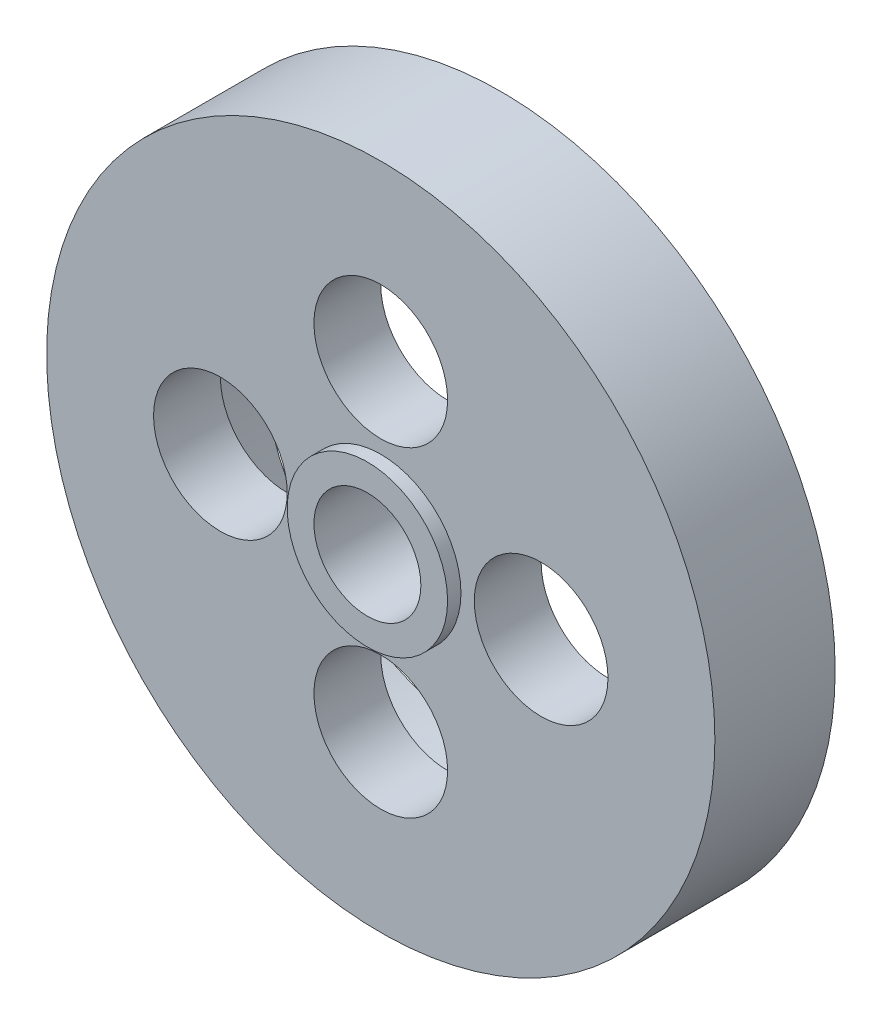
ISO-10303-21;
HEADER;
FILE_DESCRIPTION(('STEP AP214'),'2;1');
FILE_NAME('part.step','',(''),(''),'','','');
FILE_SCHEMA(('AUTOMOTIVE_DESIGN { 1 0 10303 214 1 1 1 1 }'));
ENDSEC;
DATA;
#1=APPLICATION_CONTEXT('core data for automotive mechanical design processes');
#2=APPLICATION_PROTOCOL_DEFINITION('international standard','automotive_design',2000,#1);
#3=PRODUCT_CONTEXT('',#1,'mechanical');
#4=PRODUCT('Part','Part','',(#3));
#5=PRODUCT_RELATED_PRODUCT_CATEGORY('part','',(#4));
#6=PRODUCT_DEFINITION_FORMATION('','',#4);
#7=PRODUCT_DEFINITION_CONTEXT('part definition',#1,'design');
#8=PRODUCT_DEFINITION('design','',#6,#7);
#9=PRODUCT_DEFINITION_SHAPE('','',#8);
#10=(LENGTH_UNIT() NAMED_UNIT(*) SI_UNIT(.MILLI.,.METRE.));
#11=(NAMED_UNIT(*) PLANE_ANGLE_UNIT() SI_UNIT($,.RADIAN.));
#12=(NAMED_UNIT(*) SI_UNIT($,.STERADIAN.) SOLID_ANGLE_UNIT());
#13=UNCERTAINTY_MEASURE_WITH_UNIT(LENGTH_MEASURE(1.E-05),#10,'distance_accuracy_value','');
#14=(GEOMETRIC_REPRESENTATION_CONTEXT(3) GLOBAL_UNCERTAINTY_ASSIGNED_CONTEXT((#13)) GLOBAL_UNIT_ASSIGNED_CONTEXT((#10,
#11,#12)) REPRESENTATION_CONTEXT('',''));
#15=CARTESIAN_POINT('',(0.,0.,0.));
#16=DIRECTION('',(0.,0.,1.));
#17=DIRECTION('',(1.,0.,0.));
#18=AXIS2_PLACEMENT_3D('',#15,#16,#17);
#19=CARTESIAN_POINT('',(0.,0.,9.));
#20=DIRECTION('',(0.,0.,1.));
#21=DIRECTION('',(1.,0.,0.));
#22=AXIS2_PLACEMENT_3D('',#19,#20,#21);
#23=PLANE('',#22);
#24=CARTESIAN_POINT('',(-12.,0.,9.));
#25=DIRECTION('',(0.,0.,1.));
#26=DIRECTION('',(1.,0.,0.));
#27=AXIS2_PLACEMENT_3D('',#24,#25,#26);
#28=CIRCLE('',#27,5.00000000000012);
#29=CARTESIAN_POINT('',(-6.99999999999988,0.,9.));
#30=VERTEX_POINT('',#29);
#31=EDGE_CURVE('E67',#30,#30,#28,.T.);
#32=ORIENTED_EDGE('',*,*,#31,.F.);
#33=EDGE_LOOP('',(#32));
#34=FACE_BOUND('',#33,.T.);
#35=CARTESIAN_POINT('',(12.,0.,9.));
#36=DIRECTION('',(0.,0.,1.));
#37=DIRECTION('',(1.,0.,0.));
#38=AXIS2_PLACEMENT_3D('',#35,#36,#37);
#39=CIRCLE('',#38,5.);
#40=CARTESIAN_POINT('',(17.,0.,9.));
#41=VERTEX_POINT('',#40);
#42=EDGE_CURVE('E59',#41,#41,#39,.T.);
#43=ORIENTED_EDGE('',*,*,#42,.F.);
#44=EDGE_LOOP('',(#43));
#45=FACE_BOUND('',#44,.T.);
#46=CARTESIAN_POINT('',(0.,12.,9.));
#47=DIRECTION('',(0.,0.,1.));
#48=DIRECTION('',(1.,0.,0.));
#49=AXIS2_PLACEMENT_3D('',#46,#47,#48);
#50=CIRCLE('',#49,5.);
#51=CARTESIAN_POINT('',(5.,12.,9.));
#52=VERTEX_POINT('',#51);
#53=EDGE_CURVE('E54',#52,#52,#50,.T.);
#54=ORIENTED_EDGE('',*,*,#53,.F.);
#55=EDGE_LOOP('',(#54));
#56=FACE_BOUND('',#55,.T.);
#57=CARTESIAN_POINT('',(0.,0.,9.));
#58=DIRECTION('',(0.,0.,1.));
#59=DIRECTION('',(1.,0.,0.));
#60=AXIS2_PLACEMENT_3D('',#57,#58,#59);
#61=CIRCLE('',#60,25.);
#62=CARTESIAN_POINT('',(25.,0.,9.));
#63=VERTEX_POINT('',#62);
#64=EDGE_CURVE('E10',#63,#63,#61,.T.);
#65=ORIENTED_EDGE('',*,*,#64,.T.);
#66=EDGE_LOOP('',(#65));
#67=FACE_BOUND('',#66,.T.);
#68=CARTESIAN_POINT('',(0.,-12.,9.));
#69=DIRECTION('',(0.,0.,1.));
#70=DIRECTION('',(1.,0.,0.));
#71=AXIS2_PLACEMENT_3D('',#68,#69,#70);
#72=CIRCLE('',#71,5.00000000000008);
#73=CARTESIAN_POINT('',(5.00000000000008,-12.,9.));
#74=VERTEX_POINT('',#73);
#75=EDGE_CURVE('E63',#74,#74,#72,.T.);
#76=ORIENTED_EDGE('',*,*,#75,.F.);
#77=EDGE_LOOP('',(#76));
#78=FACE_BOUND('',#77,.T.);
#79=CARTESIAN_POINT('',(0.,0.,9.));
#80=DIRECTION('',(0.,0.,1.));
#81=DIRECTION('',(1.,0.,0.));
#82=AXIS2_PLACEMENT_3D('',#79,#80,#81);
#83=CIRCLE('',#82,6.);
#84=CARTESIAN_POINT('',(6.,0.,9.));
#85=VERTEX_POINT('',#84);
#86=EDGE_CURVE('E96',#85,#85,#83,.T.);
#87=ORIENTED_EDGE('',*,*,#86,.F.);
#88=EDGE_LOOP('',(#87));
#89=FACE_BOUND('',#88,.T.);
#90=ADVANCED_FACE('F39',(#34,#45,#56,#67,#78,#89),#23,.T.);
#91=CARTESIAN_POINT('',(0.,12.,9.));
#92=DIRECTION('',(0.,0.,-1.));
#93=DIRECTION('',(-1.,0.,0.));
#94=AXIS2_PLACEMENT_3D('',#91,#92,#93);
#95=CYLINDRICAL_SURFACE('',#94,5.);
#96=ORIENTED_EDGE('',*,*,#53,.T.);
#97=EDGE_LOOP('',(#96));
#98=FACE_BOUND('',#97,.T.);
#99=CARTESIAN_POINT('',(0.,12.,4.));
#100=DIRECTION('',(0.,0.,-1.));
#101=DIRECTION('',(-1.,0.,0.));
#102=AXIS2_PLACEMENT_3D('',#99,#100,#101);
#103=CIRCLE('',#102,5.);
#104=CARTESIAN_POINT('',(-5.,12.,4.));
#105=VERTEX_POINT('',#104);
#106=EDGE_CURVE('E71',#105,#105,#103,.T.);
#107=ORIENTED_EDGE('',*,*,#106,.T.);
#108=EDGE_LOOP('',(#107));
#109=FACE_BOUND('',#108,.T.);
#110=ADVANCED_FACE('F126',(#98,#109),#95,.F.);
#111=CARTESIAN_POINT('',(0.,0.,9.));
#112=DIRECTION('',(0.,0.,-1.));
#113=DIRECTION('',(-1.,0.,0.));
#114=AXIS2_PLACEMENT_3D('',#111,#112,#113);
#115=CYLINDRICAL_SURFACE('',#114,4.);
#116=CARTESIAN_POINT('',(0.,0.,4.));
#117=DIRECTION('',(0.,0.,-1.));
#118=DIRECTION('',(-1.,0.,0.));
#119=AXIS2_PLACEMENT_3D('',#116,#117,#118);
#120=CIRCLE('',#119,4.);
#121=CARTESIAN_POINT('',(-4.,0.,4.));
#122=VERTEX_POINT('',#121);
#123=EDGE_CURVE('E75',#122,#122,#120,.T.);
#124=ORIENTED_EDGE('',*,*,#123,.T.);
#125=EDGE_LOOP('',(#124));
#126=FACE_BOUND('',#125,.T.);
#127=CARTESIAN_POINT('',(0.,0.,10.));
#128=DIRECTION('',(0.,0.,1.));
#129=DIRECTION('',(1.,0.,0.));
#130=AXIS2_PLACEMENT_3D('',#127,#128,#129);
#131=CIRCLE('',#130,4.);
#132=CARTESIAN_POINT('',(4.,0.,10.));
#133=VERTEX_POINT('',#132);
#134=EDGE_CURVE('E100',#133,#133,#131,.T.);
#135=ORIENTED_EDGE('',*,*,#134,.T.);
#136=EDGE_LOOP('',(#135));
#137=FACE_BOUND('',#136,.T.);
#138=ADVANCED_FACE('F108',(#126,#137),#115,.F.);
#139=CARTESIAN_POINT('',(12.,0.,9.));
#140=DIRECTION('',(0.,0.,-1.));
#141=DIRECTION('',(-1.,0.,0.));
#142=AXIS2_PLACEMENT_3D('',#139,#140,#141);
#143=CYLINDRICAL_SURFACE('',#142,5.);
#144=ORIENTED_EDGE('',*,*,#42,.T.);
#145=EDGE_LOOP('',(#144));
#146=FACE_BOUND('',#145,.T.);
#147=CARTESIAN_POINT('',(12.,0.,4.));
#148=DIRECTION('',(0.,0.,-1.));
#149=DIRECTION('',(-1.,0.,0.));
#150=AXIS2_PLACEMENT_3D('',#147,#148,#149);
#151=CIRCLE('',#150,5.);
#152=CARTESIAN_POINT('',(7.,0.,4.));
#153=VERTEX_POINT('',#152);
#154=EDGE_CURVE('E79',#153,#153,#151,.T.);
#155=ORIENTED_EDGE('',*,*,#154,.T.);
#156=EDGE_LOOP('',(#155));
#157=FACE_BOUND('',#156,.T.);
#158=ADVANCED_FACE('F163',(#146,#157),#143,.F.);
#159=CARTESIAN_POINT('',(0.,-12.,9.));
#160=DIRECTION('',(0.,0.,-1.));
#161=DIRECTION('',(-1.,0.,0.));
#162=AXIS2_PLACEMENT_3D('',#159,#160,#161);
#163=CYLINDRICAL_SURFACE('',#162,5.00000000000008);
#164=ORIENTED_EDGE('',*,*,#75,.T.);
#165=EDGE_LOOP('',(#164));
#166=FACE_BOUND('',#165,.T.);
#167=CARTESIAN_POINT('',(0.,-12.,4.));
#168=DIRECTION('',(0.,0.,-1.));
#169=DIRECTION('',(-1.,0.,0.));
#170=AXIS2_PLACEMENT_3D('',#167,#168,#169);
#171=CIRCLE('',#170,5.00000000000008);
#172=CARTESIAN_POINT('',(-5.00000000000008,-12.,4.));
#173=VERTEX_POINT('',#172);
#174=EDGE_CURVE('E83',#173,#173,#171,.T.);
#175=ORIENTED_EDGE('',*,*,#174,.T.);
#176=EDGE_LOOP('',(#175));
#177=FACE_BOUND('',#176,.T.);
#178=ADVANCED_FACE('F146',(#166,#177),#163,.F.);
#179=CARTESIAN_POINT('',(-12.,0.,9.));
#180=DIRECTION('',(0.,0.,-1.));
#181=DIRECTION('',(-1.,0.,0.));
#182=AXIS2_PLACEMENT_3D('',#179,#180,#181);
#183=CYLINDRICAL_SURFACE('',#182,5.00000000000012);
#184=ORIENTED_EDGE('',*,*,#31,.T.);
#185=EDGE_LOOP('',(#184));
#186=FACE_BOUND('',#185,.T.);
#187=CARTESIAN_POINT('',(-12.,0.,4.));
#188=DIRECTION('',(0.,0.,-1.));
#189=DIRECTION('',(-1.,0.,0.));
#190=AXIS2_PLACEMENT_3D('',#187,#188,#189);
#191=CIRCLE('',#190,5.00000000000012);
#192=CARTESIAN_POINT('',(-17.0000000000001,0.,4.));
#193=VERTEX_POINT('',#192);
#194=EDGE_CURVE('E43',#193,#193,#191,.T.);
#195=ORIENTED_EDGE('',*,*,#194,.T.);
#196=EDGE_LOOP('',(#195));
#197=FACE_BOUND('',#196,.T.);
#198=ADVANCED_FACE('F139',(#186,#197),#183,.F.);
#199=CARTESIAN_POINT('',(0.,0.,0.));
#200=DIRECTION('',(0.,0.,1.));
#201=DIRECTION('',(1.,0.,0.));
#202=AXIS2_PLACEMENT_3D('',#199,#200,#201);
#203=PLANE('',#202);
#204=CARTESIAN_POINT('',(0.,0.,0.));
#205=DIRECTION('',(0.,0.,-1.));
#206=DIRECTION('',(-1.,0.,0.));
#207=AXIS2_PLACEMENT_3D('',#204,#205,#206);
#208=CIRCLE('',#207,18.);
#209=CARTESIAN_POINT('',(-18.,0.,0.));
#210=VERTEX_POINT('',#209);
#211=EDGE_CURVE('E87',#210,#210,#208,.T.);
#212=ORIENTED_EDGE('',*,*,#211,.F.);
#213=EDGE_LOOP('',(#212));
#214=FACE_BOUND('',#213,.T.);
#215=CARTESIAN_POINT('',(0.,0.,0.));
#216=DIRECTION('',(0.,0.,1.));
#217=DIRECTION('',(1.,0.,0.));
#218=AXIS2_PLACEMENT_3D('',#215,#216,#217);
#219=CIRCLE('',#218,25.);
#220=CARTESIAN_POINT('',(25.,0.,0.));
#221=VERTEX_POINT('',#220);
#222=EDGE_CURVE('E48',#221,#221,#219,.T.);
#223=ORIENTED_EDGE('',*,*,#222,.F.);
#224=EDGE_LOOP('',(#223));
#225=FACE_BOUND('',#224,.T.);
#226=ADVANCED_FACE('F137',(#214,#225),#203,.F.);
#227=CARTESIAN_POINT('',(0.,0.,9.));
#228=DIRECTION('',(0.,0.,-1.));
#229=DIRECTION('',(-1.,0.,0.));
#230=AXIS2_PLACEMENT_3D('',#227,#228,#229);
#231=CYLINDRICAL_SURFACE('',#230,25.);
#232=ORIENTED_EDGE('',*,*,#64,.F.);
#233=EDGE_LOOP('',(#232));
#234=FACE_BOUND('',#233,.T.);
#235=ORIENTED_EDGE('',*,*,#222,.T.);
#236=EDGE_LOOP('',(#235));
#237=FACE_BOUND('',#236,.T.);
#238=ADVANCED_FACE('F41',(#234,#237),#231,.T.);
#239=CARTESIAN_POINT('',(0.,0.,4.));
#240=DIRECTION('',(0.,0.,-1.));
#241=DIRECTION('',(-1.,0.,0.));
#242=AXIS2_PLACEMENT_3D('',#239,#240,#241);
#243=CYLINDRICAL_SURFACE('',#242,18.);
#244=CARTESIAN_POINT('',(0.,0.,4.));
#245=DIRECTION('',(0.,0.,-1.));
#246=DIRECTION('',(-1.,0.,0.));
#247=AXIS2_PLACEMENT_3D('',#244,#245,#246);
#248=CIRCLE('',#247,18.);
#249=CARTESIAN_POINT('',(-18.,0.,4.));
#250=VERTEX_POINT('',#249);
#251=EDGE_CURVE('E91',#250,#250,#248,.T.);
#252=ORIENTED_EDGE('',*,*,#251,.F.);
#253=EDGE_LOOP('',(#252));
#254=FACE_BOUND('',#253,.T.);
#255=ORIENTED_EDGE('',*,*,#211,.T.);
#256=EDGE_LOOP('',(#255));
#257=FACE_BOUND('',#256,.T.);
#258=ADVANCED_FACE('F122',(#254,#257),#243,.F.);
#259=CARTESIAN_POINT('',(0.,0.,4.));
#260=DIRECTION('',(0.,0.,-1.));
#261=DIRECTION('',(-1.,0.,0.));
#262=AXIS2_PLACEMENT_3D('',#259,#260,#261);
#263=PLANE('',#262);
#264=ORIENTED_EDGE('',*,*,#106,.F.);
#265=EDGE_LOOP('',(#264));
#266=FACE_BOUND('',#265,.T.);
#267=ORIENTED_EDGE('',*,*,#123,.F.);
#268=EDGE_LOOP('',(#267));
#269=FACE_BOUND('',#268,.T.);
#270=ORIENTED_EDGE('',*,*,#154,.F.);
#271=EDGE_LOOP('',(#270));
#272=FACE_BOUND('',#271,.T.);
#273=ORIENTED_EDGE('',*,*,#174,.F.);
#274=EDGE_LOOP('',(#273));
#275=FACE_BOUND('',#274,.T.);
#276=ORIENTED_EDGE('',*,*,#194,.F.);
#277=EDGE_LOOP('',(#276));
#278=FACE_BOUND('',#277,.T.);
#279=ORIENTED_EDGE('',*,*,#251,.T.);
#280=EDGE_LOOP('',(#279));
#281=FACE_BOUND('',#280,.T.);
#282=ADVANCED_FACE('F113',(#266,#269,#272,#275,#278,#281),#263,.T.);
#283=CARTESIAN_POINT('',(0.,0.,10.));
#284=DIRECTION('',(0.,0.,1.));
#285=DIRECTION('',(1.,0.,0.));
#286=AXIS2_PLACEMENT_3D('',#283,#284,#285);
#287=PLANE('',#286);
#288=CARTESIAN_POINT('',(0.,0.,10.));
#289=DIRECTION('',(0.,0.,1.));
#290=DIRECTION('',(1.,0.,0.));
#291=AXIS2_PLACEMENT_3D('',#288,#289,#290);
#292=CIRCLE('',#291,6.);
#293=CARTESIAN_POINT('',(6.,0.,10.));
#294=VERTEX_POINT('',#293);
#295=EDGE_CURVE('E92',#294,#294,#292,.T.);
#296=ORIENTED_EDGE('',*,*,#295,.T.);
#297=EDGE_LOOP('',(#296));
#298=FACE_BOUND('',#297,.T.);
#299=ORIENTED_EDGE('',*,*,#134,.F.);
#300=EDGE_LOOP('',(#299));
#301=FACE_BOUND('',#300,.T.);
#302=ADVANCED_FACE('F110',(#298,#301),#287,.T.);
#303=CARTESIAN_POINT('',(0.,0.,10.));
#304=DIRECTION('',(0.,0.,-1.));
#305=DIRECTION('',(-1.,0.,0.));
#306=AXIS2_PLACEMENT_3D('',#303,#304,#305);
#307=CYLINDRICAL_SURFACE('',#306,6.);
#308=ORIENTED_EDGE('',*,*,#295,.F.);
#309=EDGE_LOOP('',(#308));
#310=FACE_BOUND('',#309,.T.);
#311=ORIENTED_EDGE('',*,*,#86,.T.);
#312=EDGE_LOOP('',(#311));
#313=FACE_BOUND('',#312,.T.);
#314=ADVANCED_FACE('F112',(#310,#313),#307,.T.);
#315=CLOSED_SHELL('',(#90,#110,#138,#158,#178,#198,#226,#238,#258,#282,#302,#314));
#316=MANIFOLD_SOLID_BREP('B2',#315);
#317=ADVANCED_BREP_SHAPE_REPRESENTATION('',(#18,#316),#14);
#318=SHAPE_DEFINITION_REPRESENTATION(#9,#317);
ENDSEC;
END-ISO-10303-21;
